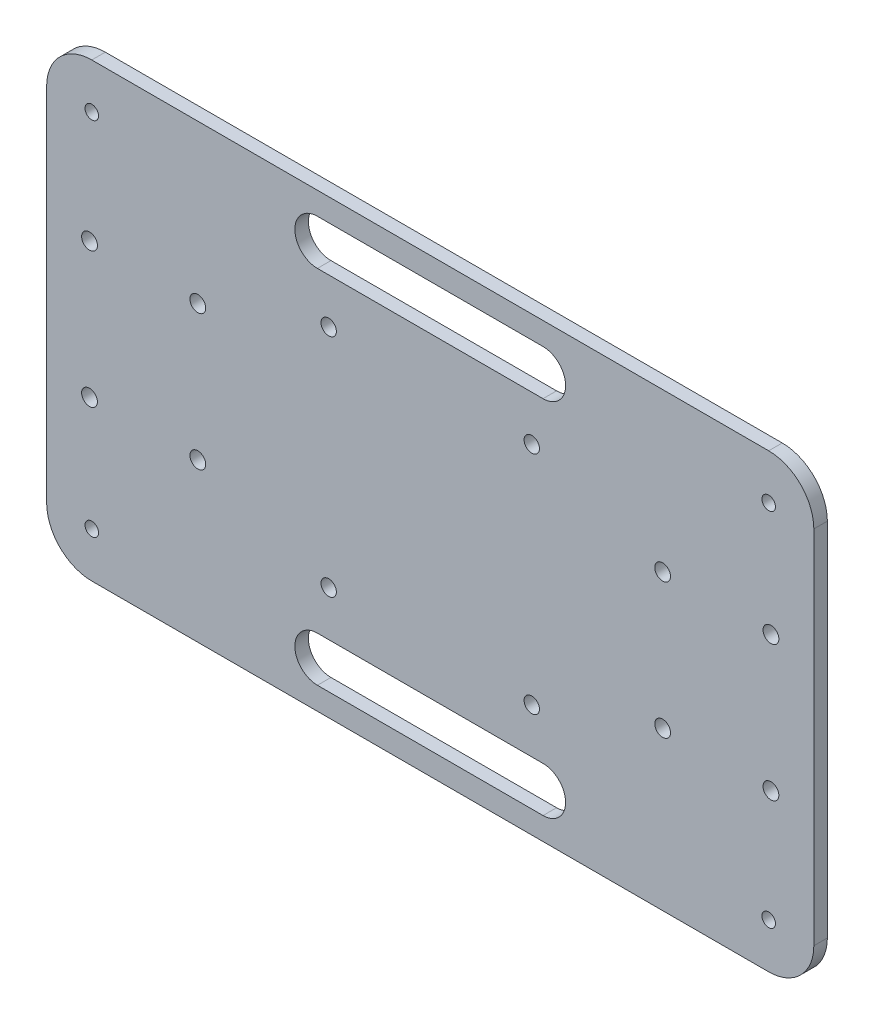
ISO-10303-21;
HEADER;
FILE_DESCRIPTION(('STEP AP214'),'2;1');
FILE_NAME('part.step','',(''),(''),'','','');
FILE_SCHEMA(('AUTOMOTIVE_DESIGN { 1 0 10303 214 1 1 1 1 }'));
ENDSEC;
DATA;
#1=APPLICATION_CONTEXT('core data for automotive mechanical design processes');
#2=APPLICATION_PROTOCOL_DEFINITION('international standard','automotive_design',2000,#1);
#3=PRODUCT_CONTEXT('',#1,'mechanical');
#4=PRODUCT('Part','Part','',(#3));
#5=PRODUCT_RELATED_PRODUCT_CATEGORY('part','',(#4));
#6=PRODUCT_DEFINITION_FORMATION('','',#4);
#7=PRODUCT_DEFINITION_CONTEXT('part definition',#1,'design');
#8=PRODUCT_DEFINITION('design','',#6,#7);
#9=PRODUCT_DEFINITION_SHAPE('','',#8);
#10=(LENGTH_UNIT() NAMED_UNIT(*) SI_UNIT(.MILLI.,.METRE.));
#11=(NAMED_UNIT(*) PLANE_ANGLE_UNIT() SI_UNIT($,.RADIAN.));
#12=(NAMED_UNIT(*) SI_UNIT($,.STERADIAN.) SOLID_ANGLE_UNIT());
#13=UNCERTAINTY_MEASURE_WITH_UNIT(LENGTH_MEASURE(1.E-05),#10,'distance_accuracy_value','');
#14=(GEOMETRIC_REPRESENTATION_CONTEXT(3) GLOBAL_UNCERTAINTY_ASSIGNED_CONTEXT((#13)) GLOBAL_UNIT_ASSIGNED_CONTEXT((#10,
#11,#12)) REPRESENTATION_CONTEXT('',''));
#15=CARTESIAN_POINT('',(0.,0.,0.));
#16=DIRECTION('',(0.,0.,1.));
#17=DIRECTION('',(1.,0.,0.));
#18=AXIS2_PLACEMENT_3D('',#15,#16,#17);
#19=CARTESIAN_POINT('',(0.,-35.,3.));
#20=DIRECTION('',(0.,1.,0.));
#21=DIRECTION('',(0.,0.,1.));
#22=AXIS2_PLACEMENT_3D('',#19,#20,#21);
#23=PLANE('',#22);
#24=DIRECTION('',(1.,0.,0.));
#25=VECTOR('',#24,1.);
#26=CARTESIAN_POINT('',(0.,-35.,0.));
#27=LINE('',#26,#25);
#28=CARTESIAN_POINT('',(-25.,-35.,0.));
#29=VERTEX_POINT('',#28);
#30=CARTESIAN_POINT('',(25.,-35.,0.));
#31=VERTEX_POINT('',#30);
#32=EDGE_CURVE('E261',#29,#31,#27,.T.);
#33=ORIENTED_EDGE('',*,*,#32,.T.);
#34=DIRECTION('',(0.,0.,-1.));
#35=VECTOR('',#34,1.);
#36=CARTESIAN_POINT('',(25.,-35.,3.));
#37=LINE('',#36,#35);
#38=CARTESIAN_POINT('',(25.,-35.,3.));
#39=VERTEX_POINT('',#38);
#40=EDGE_CURVE('E11',#39,#31,#37,.T.);
#41=ORIENTED_EDGE('',*,*,#40,.F.);
#42=DIRECTION('',(1.,0.,0.));
#43=VECTOR('',#42,1.);
#44=CARTESIAN_POINT('',(0.,-35.,3.));
#45=LINE('',#44,#43);
#46=CARTESIAN_POINT('',(-25.,-35.,3.));
#47=VERTEX_POINT('',#46);
#48=EDGE_CURVE('E163',#47,#39,#45,.T.);
#49=ORIENTED_EDGE('',*,*,#48,.F.);
#50=DIRECTION('',(0.,0.,-1.));
#51=VECTOR('',#50,1.);
#52=CARTESIAN_POINT('',(-25.,-35.,3.));
#53=LINE('',#52,#51);
#54=EDGE_CURVE('E293',#47,#29,#53,.T.);
#55=ORIENTED_EDGE('',*,*,#54,.T.);
#56=EDGE_LOOP('',(#33,#41,#49,#55));
#57=FACE_BOUND('',#56,.T.);
#58=ADVANCED_FACE('F37',(#57),#23,.F.);
#59=CARTESIAN_POINT('',(25.,-40.,3.));
#60=DIRECTION('',(0.,0.,-1.));
#61=DIRECTION('',(-1.,0.,0.));
#62=AXIS2_PLACEMENT_3D('',#59,#60,#61);
#63=CYLINDRICAL_SURFACE('',#62,5.);
#64=CARTESIAN_POINT('',(25.,-40.,0.));
#65=DIRECTION('',(0.,0.,1.));
#66=DIRECTION('',(1.,0.,0.));
#67=AXIS2_PLACEMENT_3D('',#64,#65,#66);
#68=CIRCLE('',#67,5.);
#69=CARTESIAN_POINT('',(25.,-45.,0.));
#70=VERTEX_POINT('',#69);
#71=EDGE_CURVE('E169',#31,#70,#68,.F.);
#72=ORIENTED_EDGE('',*,*,#71,.T.);
#73=DIRECTION('',(0.,0.,-1.));
#74=VECTOR('',#73,1.);
#75=CARTESIAN_POINT('',(25.,-45.,3.));
#76=LINE('',#75,#74);
#77=CARTESIAN_POINT('',(25.,-45.,3.));
#78=VERTEX_POINT('',#77);
#79=EDGE_CURVE('E47',#78,#70,#76,.T.);
#80=ORIENTED_EDGE('',*,*,#79,.F.);
#81=CARTESIAN_POINT('',(25.,-40.,3.));
#82=DIRECTION('',(0.,0.,1.));
#83=DIRECTION('',(1.,0.,0.));
#84=AXIS2_PLACEMENT_3D('',#81,#82,#83);
#85=CIRCLE('',#84,5.);
#86=EDGE_CURVE('E156',#39,#78,#85,.F.);
#87=ORIENTED_EDGE('',*,*,#86,.F.);
#88=ORIENTED_EDGE('',*,*,#40,.T.);
#89=EDGE_LOOP('',(#72,#80,#87,#88));
#90=FACE_BOUND('',#89,.T.);
#91=ADVANCED_FACE('F168',(#90),#63,.F.);
#92=CARTESIAN_POINT('',(0.,-45.,3.));
#93=DIRECTION('',(0.,1.,0.));
#94=DIRECTION('',(0.,0.,1.));
#95=AXIS2_PLACEMENT_3D('',#92,#93,#94);
#96=PLANE('',#95);
#97=DIRECTION('',(1.,0.,0.));
#98=VECTOR('',#97,1.);
#99=CARTESIAN_POINT('',(0.,-45.,0.));
#100=LINE('',#99,#98);
#101=CARTESIAN_POINT('',(-25.,-45.,0.));
#102=VERTEX_POINT('',#101);
#103=EDGE_CURVE('E265',#102,#70,#100,.T.);
#104=ORIENTED_EDGE('',*,*,#103,.F.);
#105=DIRECTION('',(0.,0.,-1.));
#106=VECTOR('',#105,1.);
#107=CARTESIAN_POINT('',(-25.,-45.,3.));
#108=LINE('',#107,#106);
#109=CARTESIAN_POINT('',(-25.,-45.,3.));
#110=VERTEX_POINT('',#109);
#111=EDGE_CURVE('E108',#110,#102,#108,.T.);
#112=ORIENTED_EDGE('',*,*,#111,.F.);
#113=DIRECTION('',(1.,0.,0.));
#114=VECTOR('',#113,1.);
#115=CARTESIAN_POINT('',(0.,-45.,3.));
#116=LINE('',#115,#114);
#117=EDGE_CURVE('E161',#110,#78,#116,.T.);
#118=ORIENTED_EDGE('',*,*,#117,.T.);
#119=ORIENTED_EDGE('',*,*,#79,.T.);
#120=EDGE_LOOP('',(#104,#112,#118,#119));
#121=FACE_BOUND('',#120,.T.);
#122=ADVANCED_FACE('F174',(#121),#96,.T.);
#123=CARTESIAN_POINT('',(25.,40.,3.));
#124=DIRECTION('',(0.,0.,-1.));
#125=DIRECTION('',(-1.,0.,0.));
#126=AXIS2_PLACEMENT_3D('',#123,#124,#125);
#127=CYLINDRICAL_SURFACE('',#126,5.);
#128=CARTESIAN_POINT('',(25.,40.,0.));
#129=DIRECTION('',(0.,0.,1.));
#130=DIRECTION('',(1.,0.,0.));
#131=AXIS2_PLACEMENT_3D('',#128,#129,#130);
#132=CIRCLE('',#131,5.);
#133=CARTESIAN_POINT('',(25.,35.,0.));
#134=VERTEX_POINT('',#133);
#135=CARTESIAN_POINT('',(25.,45.,0.));
#136=VERTEX_POINT('',#135);
#137=EDGE_CURVE('E249',#134,#136,#132,.T.);
#138=ORIENTED_EDGE('',*,*,#137,.F.);
#139=DIRECTION('',(0.,0.,-1.));
#140=VECTOR('',#139,1.);
#141=CARTESIAN_POINT('',(25.,35.,3.));
#142=LINE('',#141,#140);
#143=CARTESIAN_POINT('',(25.,35.,3.));
#144=VERTEX_POINT('',#143);
#145=EDGE_CURVE('E295',#144,#134,#142,.T.);
#146=ORIENTED_EDGE('',*,*,#145,.F.);
#147=CARTESIAN_POINT('',(25.,40.,3.));
#148=DIRECTION('',(0.,0.,1.));
#149=DIRECTION('',(1.,0.,0.));
#150=AXIS2_PLACEMENT_3D('',#147,#148,#149);
#151=CIRCLE('',#150,5.);
#152=CARTESIAN_POINT('',(25.,45.,3.));
#153=VERTEX_POINT('',#152);
#154=EDGE_CURVE('E381',#144,#153,#151,.T.);
#155=ORIENTED_EDGE('',*,*,#154,.T.);
#156=DIRECTION('',(0.,0.,-1.));
#157=VECTOR('',#156,1.);
#158=CARTESIAN_POINT('',(25.,45.,3.));
#159=LINE('',#158,#157);
#160=EDGE_CURVE('E297',#153,#136,#159,.T.);
#161=ORIENTED_EDGE('',*,*,#160,.T.);
#162=EDGE_LOOP('',(#138,#146,#155,#161));
#163=FACE_BOUND('',#162,.T.);
#164=ADVANCED_FACE('F402',(#163),#127,.F.);
#165=CARTESIAN_POINT('',(0.,35.,3.));
#166=DIRECTION('',(0.,1.,0.));
#167=DIRECTION('',(0.,0.,1.));
#168=AXIS2_PLACEMENT_3D('',#165,#166,#167);
#169=PLANE('',#168);
#170=DIRECTION('',(1.,0.,0.));
#171=VECTOR('',#170,1.);
#172=CARTESIAN_POINT('',(0.,35.,0.));
#173=LINE('',#172,#171);
#174=CARTESIAN_POINT('',(-25.,35.,0.));
#175=VERTEX_POINT('',#174);
#176=EDGE_CURVE('E252',#175,#134,#173,.T.);
#177=ORIENTED_EDGE('',*,*,#176,.F.);
#178=DIRECTION('',(0.,0.,-1.));
#179=VECTOR('',#178,1.);
#180=CARTESIAN_POINT('',(-25.,35.,3.));
#181=LINE('',#180,#179);
#182=CARTESIAN_POINT('',(-25.,35.,3.));
#183=VERTEX_POINT('',#182);
#184=EDGE_CURVE('E301',#183,#175,#181,.T.);
#185=ORIENTED_EDGE('',*,*,#184,.F.);
#186=DIRECTION('',(1.,0.,0.));
#187=VECTOR('',#186,1.);
#188=CARTESIAN_POINT('',(0.,35.,3.));
#189=LINE('',#188,#187);
#190=EDGE_CURVE('E384',#183,#144,#189,.T.);
#191=ORIENTED_EDGE('',*,*,#190,.T.);
#192=ORIENTED_EDGE('',*,*,#145,.T.);
#193=EDGE_LOOP('',(#177,#185,#191,#192));
#194=FACE_BOUND('',#193,.T.);
#195=ADVANCED_FACE('F405',(#194),#169,.T.);
#196=CARTESIAN_POINT('',(-25.,40.,3.));
#197=DIRECTION('',(0.,0.,-1.));
#198=DIRECTION('',(-1.,0.,0.));
#199=AXIS2_PLACEMENT_3D('',#196,#197,#198);
#200=CYLINDRICAL_SURFACE('',#199,5.);
#201=CARTESIAN_POINT('',(-25.,40.,0.));
#202=DIRECTION('',(0.,0.,1.));
#203=DIRECTION('',(1.,0.,0.));
#204=AXIS2_PLACEMENT_3D('',#201,#202,#203);
#205=CIRCLE('',#204,5.);
#206=CARTESIAN_POINT('',(-25.,45.,0.));
#207=VERTEX_POINT('',#206);
#208=EDGE_CURVE('E255',#207,#175,#205,.T.);
#209=ORIENTED_EDGE('',*,*,#208,.F.);
#210=DIRECTION('',(0.,0.,-1.));
#211=VECTOR('',#210,1.);
#212=CARTESIAN_POINT('',(-25.,45.,3.));
#213=LINE('',#212,#211);
#214=CARTESIAN_POINT('',(-25.,45.,3.));
#215=VERTEX_POINT('',#214);
#216=EDGE_CURVE('E299',#215,#207,#213,.T.);
#217=ORIENTED_EDGE('',*,*,#216,.F.);
#218=CARTESIAN_POINT('',(-25.,40.,3.));
#219=DIRECTION('',(0.,0.,1.));
#220=DIRECTION('',(1.,0.,0.));
#221=AXIS2_PLACEMENT_3D('',#218,#219,#220);
#222=CIRCLE('',#221,5.);
#223=EDGE_CURVE('E387',#215,#183,#222,.T.);
#224=ORIENTED_EDGE('',*,*,#223,.T.);
#225=ORIENTED_EDGE('',*,*,#184,.T.);
#226=EDGE_LOOP('',(#209,#217,#224,#225));
#227=FACE_BOUND('',#226,.T.);
#228=ADVANCED_FACE('F408',(#227),#200,.F.);
#229=CARTESIAN_POINT('',(85.,0.,3.));
#230=DIRECTION('',(1.,0.,0.));
#231=DIRECTION('',(0.,0.,-1.));
#232=AXIS2_PLACEMENT_3D('',#229,#230,#231);
#233=PLANE('',#232);
#234=DIRECTION('',(0.,-1.,0.));
#235=VECTOR('',#234,1.);
#236=CARTESIAN_POINT('',(85.,0.,0.));
#237=LINE('',#236,#235);
#238=CARTESIAN_POINT('',(85.,39.9999999999999,0.));
#239=VERTEX_POINT('',#238);
#240=CARTESIAN_POINT('',(85.,-39.9999999999999,0.));
#241=VERTEX_POINT('',#240);
#242=EDGE_CURVE('E204',#239,#241,#237,.T.);
#243=ORIENTED_EDGE('',*,*,#242,.F.);
#244=DIRECTION('',(0.,0.,-1.));
#245=VECTOR('',#244,1.);
#246=CARTESIAN_POINT('',(85.,39.9999999999999,3.));
#247=LINE('',#246,#245);
#248=CARTESIAN_POINT('',(85.,39.9999999999999,3.));
#249=VERTEX_POINT('',#248);
#250=EDGE_CURVE('E41',#249,#239,#247,.T.);
#251=ORIENTED_EDGE('',*,*,#250,.F.);
#252=DIRECTION('',(0.,-1.,0.));
#253=VECTOR('',#252,1.);
#254=CARTESIAN_POINT('',(85.,0.,3.));
#255=LINE('',#254,#253);
#256=CARTESIAN_POINT('',(85.,-39.9999999999999,3.));
#257=VERTEX_POINT('',#256);
#258=EDGE_CURVE('E292',#249,#257,#255,.T.);
#259=ORIENTED_EDGE('',*,*,#258,.T.);
#260=DIRECTION('',(0.,0.,-1.));
#261=VECTOR('',#260,1.);
#262=CARTESIAN_POINT('',(85.,-39.9999999999999,3.));
#263=LINE('',#262,#261);
#264=EDGE_CURVE('E203',#257,#241,#263,.T.);
#265=ORIENTED_EDGE('',*,*,#264,.T.);
#266=EDGE_LOOP('',(#243,#251,#259,#265));
#267=FACE_BOUND('',#266,.T.);
#268=ADVANCED_FACE('F39',(#267),#233,.T.);
#269=CARTESIAN_POINT('',(75.,40.,3.));
#270=DIRECTION('',(0.,0.,-1.));
#271=DIRECTION('',(-1.,0.,0.));
#272=AXIS2_PLACEMENT_3D('',#269,#270,#271);
#273=CYLINDRICAL_SURFACE('',#272,9.99999999999999);
#274=CARTESIAN_POINT('',(75.,40.,0.));
#275=DIRECTION('',(0.,0.,1.));
#276=DIRECTION('',(1.,0.,0.));
#277=AXIS2_PLACEMENT_3D('',#274,#275,#276);
#278=CIRCLE('',#277,9.99999999999999);
#279=CARTESIAN_POINT('',(75.,50.,0.));
#280=VERTEX_POINT('',#279);
#281=EDGE_CURVE('E207',#280,#239,#278,.F.);
#282=ORIENTED_EDGE('',*,*,#281,.F.);
#283=DIRECTION('',(0.,0.,-1.));
#284=VECTOR('',#283,1.);
#285=CARTESIAN_POINT('',(75.,50.,3.));
#286=LINE('',#285,#284);
#287=CARTESIAN_POINT('',(75.,50.,3.));
#288=VERTEX_POINT('',#287);
#289=EDGE_CURVE('E317',#288,#280,#286,.T.);
#290=ORIENTED_EDGE('',*,*,#289,.F.);
#291=CARTESIAN_POINT('',(75.,40.,3.));
#292=DIRECTION('',(0.,0.,1.));
#293=DIRECTION('',(1.,0.,0.));
#294=AXIS2_PLACEMENT_3D('',#291,#292,#293);
#295=CIRCLE('',#294,9.99999999999999);
#296=EDGE_CURVE('E326',#288,#249,#295,.F.);
#297=ORIENTED_EDGE('',*,*,#296,.T.);
#298=ORIENTED_EDGE('',*,*,#250,.T.);
#299=EDGE_LOOP('',(#282,#290,#297,#298));
#300=FACE_BOUND('',#299,.T.);
#301=ADVANCED_FACE('F324',(#300),#273,.T.);
#302=CARTESIAN_POINT('',(0.,50.,3.));
#303=DIRECTION('',(0.,1.,0.));
#304=DIRECTION('',(0.,0.,1.));
#305=AXIS2_PLACEMENT_3D('',#302,#303,#304);
#306=PLANE('',#305);
#307=DIRECTION('',(1.,0.,0.));
#308=VECTOR('',#307,1.);
#309=CARTESIAN_POINT('',(0.,50.,0.));
#310=LINE('',#309,#308);
#311=CARTESIAN_POINT('',(-74.9999999999999,50.,0.));
#312=VERTEX_POINT('',#311);
#313=EDGE_CURVE('E210',#312,#280,#310,.T.);
#314=ORIENTED_EDGE('',*,*,#313,.F.);
#315=DIRECTION('',(0.,0.,-1.));
#316=VECTOR('',#315,1.);
#317=CARTESIAN_POINT('',(-74.9999999999999,50.,3.));
#318=LINE('',#317,#316);
#319=CARTESIAN_POINT('',(-74.9999999999999,50.,3.));
#320=VERTEX_POINT('',#319);
#321=EDGE_CURVE('E316',#320,#312,#318,.T.);
#322=ORIENTED_EDGE('',*,*,#321,.F.);
#323=DIRECTION('',(1.,0.,0.));
#324=VECTOR('',#323,1.);
#325=CARTESIAN_POINT('',(0.,50.,3.));
#326=LINE('',#325,#324);
#327=EDGE_CURVE('E336',#320,#288,#326,.T.);
#328=ORIENTED_EDGE('',*,*,#327,.T.);
#329=ORIENTED_EDGE('',*,*,#289,.T.);
#330=EDGE_LOOP('',(#314,#322,#328,#329));
#331=FACE_BOUND('',#330,.T.);
#332=ADVANCED_FACE('F334',(#331),#306,.T.);
#333=CARTESIAN_POINT('',(-75.,40.,3.));
#334=DIRECTION('',(0.,0.,-1.));
#335=DIRECTION('',(-1.,0.,0.));
#336=AXIS2_PLACEMENT_3D('',#333,#334,#335);
#337=CYLINDRICAL_SURFACE('',#336,9.99999999999999);
#338=CARTESIAN_POINT('',(-75.,40.,0.));
#339=DIRECTION('',(0.,0.,1.));
#340=DIRECTION('',(1.,0.,0.));
#341=AXIS2_PLACEMENT_3D('',#338,#339,#340);
#342=CIRCLE('',#341,9.99999999999999);
#343=CARTESIAN_POINT('',(-85.,39.9999999999999,0.));
#344=VERTEX_POINT('',#343);
#345=EDGE_CURVE('E213',#344,#312,#342,.F.);
#346=ORIENTED_EDGE('',*,*,#345,.F.);
#347=DIRECTION('',(0.,0.,-1.));
#348=VECTOR('',#347,1.);
#349=CARTESIAN_POINT('',(-85.,39.9999999999999,3.));
#350=LINE('',#349,#348);
#351=CARTESIAN_POINT('',(-85.,39.9999999999999,3.));
#352=VERTEX_POINT('',#351);
#353=EDGE_CURVE('E314',#352,#344,#350,.T.);
#354=ORIENTED_EDGE('',*,*,#353,.F.);
#355=CARTESIAN_POINT('',(-75.,40.,3.));
#356=DIRECTION('',(0.,0.,1.));
#357=DIRECTION('',(1.,0.,0.));
#358=AXIS2_PLACEMENT_3D('',#355,#356,#357);
#359=CIRCLE('',#358,9.99999999999999);
#360=EDGE_CURVE('E342',#352,#320,#359,.F.);
#361=ORIENTED_EDGE('',*,*,#360,.T.);
#362=ORIENTED_EDGE('',*,*,#321,.T.);
#363=EDGE_LOOP('',(#346,#354,#361,#362));
#364=FACE_BOUND('',#363,.T.);
#365=ADVANCED_FACE('F344',(#364),#337,.T.);
#366=CARTESIAN_POINT('',(-85.,0.,3.));
#367=DIRECTION('',(1.,0.,0.));
#368=DIRECTION('',(0.,0.,-1.));
#369=AXIS2_PLACEMENT_3D('',#366,#367,#368);
#370=PLANE('',#369);
#371=DIRECTION('',(0.,-1.,0.));
#372=VECTOR('',#371,1.);
#373=CARTESIAN_POINT('',(-85.,0.,0.));
#374=LINE('',#373,#372);
#375=CARTESIAN_POINT('',(-85.,-39.9999999999999,0.));
#376=VERTEX_POINT('',#375);
#377=EDGE_CURVE('E216',#344,#376,#374,.T.);
#378=ORIENTED_EDGE('',*,*,#377,.T.);
#379=DIRECTION('',(0.,0.,-1.));
#380=VECTOR('',#379,1.);
#381=CARTESIAN_POINT('',(-85.,-39.9999999999999,3.));
#382=LINE('',#381,#380);
#383=CARTESIAN_POINT('',(-85.,-39.9999999999999,3.));
#384=VERTEX_POINT('',#383);
#385=EDGE_CURVE('E311',#384,#376,#382,.T.);
#386=ORIENTED_EDGE('',*,*,#385,.F.);
#387=DIRECTION('',(0.,-1.,0.));
#388=VECTOR('',#387,1.);
#389=CARTESIAN_POINT('',(-85.,0.,3.));
#390=LINE('',#389,#388);
#391=EDGE_CURVE('E346',#352,#384,#390,.T.);
#392=ORIENTED_EDGE('',*,*,#391,.F.);
#393=ORIENTED_EDGE('',*,*,#353,.T.);
#394=EDGE_LOOP('',(#378,#386,#392,#393));
#395=FACE_BOUND('',#394,.T.);
#396=ADVANCED_FACE('F503',(#395),#370,.F.);
#397=CARTESIAN_POINT('',(-75.,-40.,3.));
#398=DIRECTION('',(0.,0.,-1.));
#399=DIRECTION('',(-1.,0.,0.));
#400=AXIS2_PLACEMENT_3D('',#397,#398,#399);
#401=CYLINDRICAL_SURFACE('',#400,9.99999999999999);
#402=CARTESIAN_POINT('',(-75.,-40.,0.));
#403=DIRECTION('',(0.,0.,1.));
#404=DIRECTION('',(1.,0.,0.));
#405=AXIS2_PLACEMENT_3D('',#402,#403,#404);
#406=CIRCLE('',#405,9.99999999999999);
#407=CARTESIAN_POINT('',(-74.9999999999999,-50.,0.));
#408=VERTEX_POINT('',#407);
#409=EDGE_CURVE('E218',#376,#408,#406,.T.);
#410=ORIENTED_EDGE('',*,*,#409,.T.);
#411=DIRECTION('',(0.,0.,-1.));
#412=VECTOR('',#411,1.);
#413=CARTESIAN_POINT('',(-74.9999999999999,-50.,3.));
#414=LINE('',#413,#412);
#415=CARTESIAN_POINT('',(-74.9999999999999,-50.,3.));
#416=VERTEX_POINT('',#415);
#417=EDGE_CURVE('E308',#416,#408,#414,.T.);
#418=ORIENTED_EDGE('',*,*,#417,.F.);
#419=CARTESIAN_POINT('',(-75.,-40.,3.));
#420=DIRECTION('',(0.,0.,1.));
#421=DIRECTION('',(1.,0.,0.));
#422=AXIS2_PLACEMENT_3D('',#419,#420,#421);
#423=CIRCLE('',#422,9.99999999999999);
#424=EDGE_CURVE('E348',#384,#416,#423,.T.);
#425=ORIENTED_EDGE('',*,*,#424,.F.);
#426=ORIENTED_EDGE('',*,*,#385,.T.);
#427=EDGE_LOOP('',(#410,#418,#425,#426));
#428=FACE_BOUND('',#427,.T.);
#429=ADVANCED_FACE('F499',(#428),#401,.T.);
#430=CARTESIAN_POINT('',(0.,-50.,3.));
#431=DIRECTION('',(0.,1.,0.));
#432=DIRECTION('',(0.,0.,1.));
#433=AXIS2_PLACEMENT_3D('',#430,#431,#432);
#434=PLANE('',#433);
#435=DIRECTION('',(1.,0.,0.));
#436=VECTOR('',#435,1.);
#437=CARTESIAN_POINT('',(0.,-50.,0.));
#438=LINE('',#437,#436);
#439=CARTESIAN_POINT('',(75.,-50.,0.));
#440=VERTEX_POINT('',#439);
#441=EDGE_CURVE('E220',#408,#440,#438,.T.);
#442=ORIENTED_EDGE('',*,*,#441,.T.);
#443=DIRECTION('',(0.,0.,-1.));
#444=VECTOR('',#443,1.);
#445=CARTESIAN_POINT('',(75.,-50.,3.));
#446=LINE('',#445,#444);
#447=CARTESIAN_POINT('',(75.,-50.,3.));
#448=VERTEX_POINT('',#447);
#449=EDGE_CURVE('E305',#448,#440,#446,.T.);
#450=ORIENTED_EDGE('',*,*,#449,.F.);
#451=DIRECTION('',(1.,0.,0.));
#452=VECTOR('',#451,1.);
#453=CARTESIAN_POINT('',(0.,-50.,3.));
#454=LINE('',#453,#452);
#455=EDGE_CURVE('E353',#416,#448,#454,.T.);
#456=ORIENTED_EDGE('',*,*,#455,.F.);
#457=ORIENTED_EDGE('',*,*,#417,.T.);
#458=EDGE_LOOP('',(#442,#450,#456,#457));
#459=FACE_BOUND('',#458,.T.);
#460=ADVANCED_FACE('F495',(#459),#434,.F.);
#461=CARTESIAN_POINT('',(-51.5,-15.,3.));
#462=DIRECTION('',(0.,0.,-1.));
#463=DIRECTION('',(-1.,0.,0.));
#464=AXIS2_PLACEMENT_3D('',#461,#462,#463);
#465=CYLINDRICAL_SURFACE('',#464,1.75);
#466=CARTESIAN_POINT('',(-51.5,-15.,3.));
#467=DIRECTION('',(0.,0.,1.));
#468=DIRECTION('',(1.,0.,0.));
#469=AXIS2_PLACEMENT_3D('',#466,#467,#468);
#470=CIRCLE('',#469,1.75);
#471=CARTESIAN_POINT('',(-49.75,-15.,3.));
#472=VERTEX_POINT('',#471);
#473=EDGE_CURVE('E197',#472,#472,#470,.T.);
#474=ORIENTED_EDGE('',*,*,#473,.T.);
#475=EDGE_LOOP('',(#474));
#476=FACE_BOUND('',#475,.T.);
#477=CARTESIAN_POINT('',(-51.5,-15.,0.));
#478=DIRECTION('',(0.,0.,1.));
#479=DIRECTION('',(1.,0.,0.));
#480=AXIS2_PLACEMENT_3D('',#477,#478,#479);
#481=CIRCLE('',#480,1.75);
#482=CARTESIAN_POINT('',(-49.75,-15.,0.));
#483=VERTEX_POINT('',#482);
#484=EDGE_CURVE('E286',#483,#483,#481,.T.);
#485=ORIENTED_EDGE('',*,*,#484,.F.);
#486=EDGE_LOOP('',(#485));
#487=FACE_BOUND('',#486,.T.);
#488=ADVANCED_FACE('F498',(#476,#487),#465,.F.);
#489=CARTESIAN_POINT('',(-75.5,15.,3.));
#490=DIRECTION('',(0.,0.,-1.));
#491=DIRECTION('',(-1.,0.,0.));
#492=AXIS2_PLACEMENT_3D('',#489,#490,#491);
#493=CYLINDRICAL_SURFACE('',#492,1.75);
#494=CARTESIAN_POINT('',(-75.5,15.,3.));
#495=DIRECTION('',(0.,0.,1.));
#496=DIRECTION('',(1.,0.,0.));
#497=AXIS2_PLACEMENT_3D('',#494,#495,#496);
#498=CIRCLE('',#497,1.75);
#499=CARTESIAN_POINT('',(-73.75,15.,3.));
#500=VERTEX_POINT('',#499);
#501=EDGE_CURVE('E194',#500,#500,#498,.T.);
#502=ORIENTED_EDGE('',*,*,#501,.T.);
#503=EDGE_LOOP('',(#502));
#504=FACE_BOUND('',#503,.T.);
#505=CARTESIAN_POINT('',(-75.5,15.,0.));
#506=DIRECTION('',(0.,0.,1.));
#507=DIRECTION('',(1.,0.,0.));
#508=AXIS2_PLACEMENT_3D('',#505,#506,#507);
#509=CIRCLE('',#508,1.75);
#510=CARTESIAN_POINT('',(-73.75,15.,0.));
#511=VERTEX_POINT('',#510);
#512=EDGE_CURVE('E283',#511,#511,#509,.T.);
#513=ORIENTED_EDGE('',*,*,#512,.F.);
#514=EDGE_LOOP('',(#513));
#515=FACE_BOUND('',#514,.T.);
#516=ADVANCED_FACE('F597',(#504,#515),#493,.F.);
#517=CARTESIAN_POINT('',(-75.5,-15.,3.));
#518=DIRECTION('',(0.,0.,-1.));
#519=DIRECTION('',(-1.,0.,0.));
#520=AXIS2_PLACEMENT_3D('',#517,#518,#519);
#521=CYLINDRICAL_SURFACE('',#520,1.75);
#522=CARTESIAN_POINT('',(-75.5,-15.,3.));
#523=DIRECTION('',(0.,0.,1.));
#524=DIRECTION('',(1.,0.,0.));
#525=AXIS2_PLACEMENT_3D('',#522,#523,#524);
#526=CIRCLE('',#525,1.75);
#527=CARTESIAN_POINT('',(-73.75,-15.,3.));
#528=VERTEX_POINT('',#527);
#529=EDGE_CURVE('E191',#528,#528,#526,.F.);
#530=ORIENTED_EDGE('',*,*,#529,.F.);
#531=EDGE_LOOP('',(#530));
#532=FACE_BOUND('',#531,.T.);
#533=CARTESIAN_POINT('',(-75.5,-15.,0.));
#534=DIRECTION('',(0.,0.,1.));
#535=DIRECTION('',(1.,0.,0.));
#536=AXIS2_PLACEMENT_3D('',#533,#534,#535);
#537=CIRCLE('',#536,1.75);
#538=CARTESIAN_POINT('',(-73.75,-15.,0.));
#539=VERTEX_POINT('',#538);
#540=EDGE_CURVE('E280',#539,#539,#537,.F.);
#541=ORIENTED_EDGE('',*,*,#540,.T.);
#542=EDGE_LOOP('',(#541));
#543=FACE_BOUND('',#542,.T.);
#544=ADVANCED_FACE('F605',(#532,#543),#521,.F.);
#545=CARTESIAN_POINT('',(75.5,15.,3.));
#546=DIRECTION('',(0.,0.,-1.));
#547=DIRECTION('',(-1.,0.,0.));
#548=AXIS2_PLACEMENT_3D('',#545,#546,#547);
#549=CYLINDRICAL_SURFACE('',#548,1.75);
#550=CARTESIAN_POINT('',(75.5,15.,3.));
#551=DIRECTION('',(0.,0.,1.));
#552=DIRECTION('',(1.,0.,0.));
#553=AXIS2_PLACEMENT_3D('',#550,#551,#552);
#554=CIRCLE('',#553,1.75);
#555=CARTESIAN_POINT('',(77.25,15.,3.));
#556=VERTEX_POINT('',#555);
#557=EDGE_CURVE('E188',#556,#556,#554,.F.);
#558=ORIENTED_EDGE('',*,*,#557,.F.);
#559=EDGE_LOOP('',(#558));
#560=FACE_BOUND('',#559,.T.);
#561=CARTESIAN_POINT('',(75.5,15.,0.));
#562=DIRECTION('',(0.,0.,1.));
#563=DIRECTION('',(1.,0.,0.));
#564=AXIS2_PLACEMENT_3D('',#561,#562,#563);
#565=CIRCLE('',#564,1.75);
#566=CARTESIAN_POINT('',(77.25,15.,0.));
#567=VERTEX_POINT('',#566);
#568=EDGE_CURVE('E277',#567,#567,#565,.F.);
#569=ORIENTED_EDGE('',*,*,#568,.T.);
#570=EDGE_LOOP('',(#569));
#571=FACE_BOUND('',#570,.T.);
#572=ADVANCED_FACE('F614',(#560,#571),#549,.F.);
#573=CARTESIAN_POINT('',(51.5,15.,3.));
#574=DIRECTION('',(0.,0.,-1.));
#575=DIRECTION('',(-1.,0.,0.));
#576=AXIS2_PLACEMENT_3D('',#573,#574,#575);
#577=CYLINDRICAL_SURFACE('',#576,1.75);
#578=CARTESIAN_POINT('',(51.5,15.,3.));
#579=DIRECTION('',(0.,0.,1.));
#580=DIRECTION('',(1.,0.,0.));
#581=AXIS2_PLACEMENT_3D('',#578,#579,#580);
#582=CIRCLE('',#581,1.75);
#583=CARTESIAN_POINT('',(53.25,15.,3.));
#584=VERTEX_POINT('',#583);
#585=EDGE_CURVE('E185',#584,#584,#582,.T.);
#586=ORIENTED_EDGE('',*,*,#585,.T.);
#587=EDGE_LOOP('',(#586));
#588=FACE_BOUND('',#587,.T.);
#589=CARTESIAN_POINT('',(51.5,15.,0.));
#590=DIRECTION('',(0.,0.,1.));
#591=DIRECTION('',(1.,0.,0.));
#592=AXIS2_PLACEMENT_3D('',#589,#590,#591);
#593=CIRCLE('',#592,1.75);
#594=CARTESIAN_POINT('',(53.25,15.,0.));
#595=VERTEX_POINT('',#594);
#596=EDGE_CURVE('E274',#595,#595,#593,.T.);
#597=ORIENTED_EDGE('',*,*,#596,.F.);
#598=EDGE_LOOP('',(#597));
#599=FACE_BOUND('',#598,.T.);
#600=ADVANCED_FACE('F623',(#588,#599),#577,.F.);
#601=CARTESIAN_POINT('',(75.5,-15.,3.));
#602=DIRECTION('',(0.,0.,-1.));
#603=DIRECTION('',(-1.,0.,0.));
#604=AXIS2_PLACEMENT_3D('',#601,#602,#603);
#605=CYLINDRICAL_SURFACE('',#604,1.75);
#606=CARTESIAN_POINT('',(75.5,-15.,3.));
#607=DIRECTION('',(0.,0.,1.));
#608=DIRECTION('',(1.,0.,0.));
#609=AXIS2_PLACEMENT_3D('',#606,#607,#608);
#610=CIRCLE('',#609,1.75);
#611=CARTESIAN_POINT('',(77.25,-15.,3.));
#612=VERTEX_POINT('',#611);
#613=EDGE_CURVE('E182',#612,#612,#610,.T.);
#614=ORIENTED_EDGE('',*,*,#613,.T.);
#615=EDGE_LOOP('',(#614));
#616=FACE_BOUND('',#615,.T.);
#617=CARTESIAN_POINT('',(75.5,-15.,0.));
#618=DIRECTION('',(0.,0.,1.));
#619=DIRECTION('',(1.,0.,0.));
#620=AXIS2_PLACEMENT_3D('',#617,#618,#619);
#621=CIRCLE('',#620,1.75);
#622=CARTESIAN_POINT('',(77.25,-15.,0.));
#623=VERTEX_POINT('',#622);
#624=EDGE_CURVE('E271',#623,#623,#621,.T.);
#625=ORIENTED_EDGE('',*,*,#624,.F.);
#626=EDGE_LOOP('',(#625));
#627=FACE_BOUND('',#626,.T.);
#628=ADVANCED_FACE('F632',(#616,#627),#605,.F.);
#629=CARTESIAN_POINT('',(51.5,-15.,3.));
#630=DIRECTION('',(0.,0.,-1.));
#631=DIRECTION('',(-1.,0.,0.));
#632=AXIS2_PLACEMENT_3D('',#629,#630,#631);
#633=CYLINDRICAL_SURFACE('',#632,1.75);
#634=CARTESIAN_POINT('',(51.5,-15.,3.));
#635=DIRECTION('',(0.,0.,1.));
#636=DIRECTION('',(1.,0.,0.));
#637=AXIS2_PLACEMENT_3D('',#634,#635,#636);
#638=CIRCLE('',#637,1.75);
#639=CARTESIAN_POINT('',(53.25,-15.,3.));
#640=VERTEX_POINT('',#639);
#641=EDGE_CURVE('E176',#640,#640,#638,.F.);
#642=ORIENTED_EDGE('',*,*,#641,.F.);
#643=EDGE_LOOP('',(#642));
#644=FACE_BOUND('',#643,.T.);
#645=CARTESIAN_POINT('',(51.5,-15.,0.));
#646=DIRECTION('',(0.,0.,1.));
#647=DIRECTION('',(1.,0.,0.));
#648=AXIS2_PLACEMENT_3D('',#645,#646,#647);
#649=CIRCLE('',#648,1.75);
#650=CARTESIAN_POINT('',(53.25,-15.,0.));
#651=VERTEX_POINT('',#650);
#652=EDGE_CURVE('E268',#651,#651,#649,.F.);
#653=ORIENTED_EDGE('',*,*,#652,.T.);
#654=EDGE_LOOP('',(#653));
#655=FACE_BOUND('',#654,.T.);
#656=ADVANCED_FACE('F641',(#644,#655),#633,.F.);
#657=CARTESIAN_POINT('',(-25.,-40.,3.));
#658=DIRECTION('',(0.,0.,-1.));
#659=DIRECTION('',(-1.,0.,0.));
#660=AXIS2_PLACEMENT_3D('',#657,#658,#659);
#661=CYLINDRICAL_SURFACE('',#660,5.);
#662=CARTESIAN_POINT('',(-25.,-40.,0.));
#663=DIRECTION('',(0.,0.,1.));
#664=DIRECTION('',(1.,0.,0.));
#665=AXIS2_PLACEMENT_3D('',#662,#663,#664);
#666=CIRCLE('',#665,5.);
#667=EDGE_CURVE('E111',#102,#29,#666,.F.);
#668=ORIENTED_EDGE('',*,*,#667,.T.);
#669=ORIENTED_EDGE('',*,*,#54,.F.);
#670=CARTESIAN_POINT('',(-25.,-40.,3.));
#671=DIRECTION('',(0.,0.,1.));
#672=DIRECTION('',(1.,0.,0.));
#673=AXIS2_PLACEMENT_3D('',#670,#671,#672);
#674=CIRCLE('',#673,5.);
#675=EDGE_CURVE('E56',#110,#47,#674,.F.);
#676=ORIENTED_EDGE('',*,*,#675,.F.);
#677=ORIENTED_EDGE('',*,*,#111,.T.);
#678=EDGE_LOOP('',(#668,#669,#676,#677));
#679=FACE_BOUND('',#678,.T.);
#680=ADVANCED_FACE('F458',(#679),#661,.F.);
#681=CARTESIAN_POINT('',(0.,45.,3.));
#682=DIRECTION('',(0.,1.,0.));
#683=DIRECTION('',(0.,0.,1.));
#684=AXIS2_PLACEMENT_3D('',#681,#682,#683);
#685=PLANE('',#684);
#686=DIRECTION('',(1.,0.,0.));
#687=VECTOR('',#686,1.);
#688=CARTESIAN_POINT('',(0.,45.,0.));
#689=LINE('',#688,#687);
#690=EDGE_CURVE('E258',#207,#136,#689,.T.);
#691=ORIENTED_EDGE('',*,*,#690,.T.);
#692=ORIENTED_EDGE('',*,*,#160,.F.);
#693=DIRECTION('',(1.,0.,0.));
#694=VECTOR('',#693,1.);
#695=CARTESIAN_POINT('',(0.,45.,3.));
#696=LINE('',#695,#694);
#697=EDGE_CURVE('E390',#215,#153,#696,.T.);
#698=ORIENTED_EDGE('',*,*,#697,.F.);
#699=ORIENTED_EDGE('',*,*,#216,.T.);
#700=EDGE_LOOP('',(#691,#692,#698,#699));
#701=FACE_BOUND('',#700,.T.);
#702=ADVANCED_FACE('F398',(#701),#685,.F.);
#703=CARTESIAN_POINT('',(-75.,-40.,3.));
#704=DIRECTION('',(0.,0.,-1.));
#705=DIRECTION('',(-1.,0.,0.));
#706=AXIS2_PLACEMENT_3D('',#703,#704,#705);
#707=CYLINDRICAL_SURFACE('',#706,1.5);
#708=CARTESIAN_POINT('',(-75.,-40.,3.));
#709=DIRECTION('',(0.,0.,1.));
#710=DIRECTION('',(1.,0.,0.));
#711=AXIS2_PLACEMENT_3D('',#708,#709,#710);
#712=CIRCLE('',#711,1.5);
#713=CARTESIAN_POINT('',(-73.5,-40.,3.));
#714=VERTEX_POINT('',#713);
#715=EDGE_CURVE('E378',#714,#714,#712,.T.);
#716=ORIENTED_EDGE('',*,*,#715,.T.);
#717=EDGE_LOOP('',(#716));
#718=FACE_BOUND('',#717,.T.);
#719=CARTESIAN_POINT('',(-75.,-40.,0.));
#720=DIRECTION('',(0.,0.,1.));
#721=DIRECTION('',(1.,0.,0.));
#722=AXIS2_PLACEMENT_3D('',#719,#720,#721);
#723=CIRCLE('',#722,1.5);
#724=CARTESIAN_POINT('',(-73.5,-40.,0.));
#725=VERTEX_POINT('',#724);
#726=EDGE_CURVE('E246',#725,#725,#723,.T.);
#727=ORIENTED_EDGE('',*,*,#726,.F.);
#728=EDGE_LOOP('',(#727));
#729=FACE_BOUND('',#728,.T.);
#730=ADVANCED_FACE('F457',(#718,#729),#707,.F.);
#731=CARTESIAN_POINT('',(-75.,40.,3.));
#732=DIRECTION('',(0.,0.,-1.));
#733=DIRECTION('',(-1.,0.,0.));
#734=AXIS2_PLACEMENT_3D('',#731,#732,#733);
#735=CYLINDRICAL_SURFACE('',#734,1.5);
#736=CARTESIAN_POINT('',(-75.,40.,3.));
#737=DIRECTION('',(0.,0.,1.));
#738=DIRECTION('',(1.,0.,0.));
#739=AXIS2_PLACEMENT_3D('',#736,#737,#738);
#740=CIRCLE('',#739,1.5);
#741=CARTESIAN_POINT('',(-73.5,40.,3.));
#742=VERTEX_POINT('',#741);
#743=EDGE_CURVE('E375',#742,#742,#740,.T.);
#744=ORIENTED_EDGE('',*,*,#743,.T.);
#745=EDGE_LOOP('',(#744));
#746=FACE_BOUND('',#745,.T.);
#747=CARTESIAN_POINT('',(-75.,40.,0.));
#748=DIRECTION('',(0.,0.,1.));
#749=DIRECTION('',(1.,0.,0.));
#750=AXIS2_PLACEMENT_3D('',#747,#748,#749);
#751=CIRCLE('',#750,1.5);
#752=CARTESIAN_POINT('',(-73.5,40.,0.));
#753=VERTEX_POINT('',#752);
#754=EDGE_CURVE('E243',#753,#753,#751,.T.);
#755=ORIENTED_EDGE('',*,*,#754,.F.);
#756=EDGE_LOOP('',(#755));
#757=FACE_BOUND('',#756,.T.);
#758=ADVANCED_FACE('F467',(#746,#757),#735,.F.);
#759=CARTESIAN_POINT('',(75.,40.,3.));
#760=DIRECTION('',(0.,0.,-1.));
#761=DIRECTION('',(-1.,0.,0.));
#762=AXIS2_PLACEMENT_3D('',#759,#760,#761);
#763=CYLINDRICAL_SURFACE('',#762,1.5);
#764=CARTESIAN_POINT('',(75.,40.,3.));
#765=DIRECTION('',(0.,0.,1.));
#766=DIRECTION('',(1.,0.,0.));
#767=AXIS2_PLACEMENT_3D('',#764,#765,#766);
#768=CIRCLE('',#767,1.5);
#769=CARTESIAN_POINT('',(76.5,40.,3.));
#770=VERTEX_POINT('',#769);
#771=EDGE_CURVE('E372',#770,#770,#768,.T.);
#772=ORIENTED_EDGE('',*,*,#771,.T.);
#773=EDGE_LOOP('',(#772));
#774=FACE_BOUND('',#773,.T.);
#775=CARTESIAN_POINT('',(75.,40.,0.));
#776=DIRECTION('',(0.,0.,1.));
#777=DIRECTION('',(1.,0.,0.));
#778=AXIS2_PLACEMENT_3D('',#775,#776,#777);
#779=CIRCLE('',#778,1.5);
#780=CARTESIAN_POINT('',(76.5,40.,0.));
#781=VERTEX_POINT('',#780);
#782=EDGE_CURVE('E240',#781,#781,#779,.T.);
#783=ORIENTED_EDGE('',*,*,#782,.F.);
#784=EDGE_LOOP('',(#783));
#785=FACE_BOUND('',#784,.T.);
#786=ADVANCED_FACE('F471',(#774,#785),#763,.F.);
#787=CARTESIAN_POINT('',(75.,-40.,3.));
#788=DIRECTION('',(0.,0.,-1.));
#789=DIRECTION('',(-1.,0.,0.));
#790=AXIS2_PLACEMENT_3D('',#787,#788,#789);
#791=CYLINDRICAL_SURFACE('',#790,1.5);
#792=CARTESIAN_POINT('',(75.,-40.,3.));
#793=DIRECTION('',(0.,0.,1.));
#794=DIRECTION('',(1.,0.,0.));
#795=AXIS2_PLACEMENT_3D('',#792,#793,#794);
#796=CIRCLE('',#795,1.5);
#797=CARTESIAN_POINT('',(76.5,-40.,3.));
#798=VERTEX_POINT('',#797);
#799=EDGE_CURVE('E369',#798,#798,#796,.T.);
#800=ORIENTED_EDGE('',*,*,#799,.T.);
#801=EDGE_LOOP('',(#800));
#802=FACE_BOUND('',#801,.T.);
#803=CARTESIAN_POINT('',(75.,-40.,0.));
#804=DIRECTION('',(0.,0.,1.));
#805=DIRECTION('',(1.,0.,0.));
#806=AXIS2_PLACEMENT_3D('',#803,#804,#805);
#807=CIRCLE('',#806,1.5);
#808=CARTESIAN_POINT('',(76.5,-40.,0.));
#809=VERTEX_POINT('',#808);
#810=EDGE_CURVE('E237',#809,#809,#807,.T.);
#811=ORIENTED_EDGE('',*,*,#810,.F.);
#812=EDGE_LOOP('',(#811));
#813=FACE_BOUND('',#812,.T.);
#814=ADVANCED_FACE('F475',(#802,#813),#791,.F.);
#815=CARTESIAN_POINT('',(-22.5,25.,3.));
#816=DIRECTION('',(0.,0.,-1.));
#817=DIRECTION('',(-1.,0.,0.));
#818=AXIS2_PLACEMENT_3D('',#815,#816,#817);
#819=CYLINDRICAL_SURFACE('',#818,1.7);
#820=CARTESIAN_POINT('',(-22.5,25.,3.));
#821=DIRECTION('',(0.,0.,1.));
#822=DIRECTION('',(1.,0.,0.));
#823=AXIS2_PLACEMENT_3D('',#820,#821,#822);
#824=CIRCLE('',#823,1.7);
#825=CARTESIAN_POINT('',(-20.8,25.,3.));
#826=VERTEX_POINT('',#825);
#827=EDGE_CURVE('E366',#826,#826,#824,.T.);
#828=ORIENTED_EDGE('',*,*,#827,.T.);
#829=EDGE_LOOP('',(#828));
#830=FACE_BOUND('',#829,.T.);
#831=CARTESIAN_POINT('',(-22.5,25.,0.));
#832=DIRECTION('',(0.,0.,1.));
#833=DIRECTION('',(1.,0.,0.));
#834=AXIS2_PLACEMENT_3D('',#831,#832,#833);
#835=CIRCLE('',#834,1.7);
#836=CARTESIAN_POINT('',(-20.8,25.,0.));
#837=VERTEX_POINT('',#836);
#838=EDGE_CURVE('E234',#837,#837,#835,.T.);
#839=ORIENTED_EDGE('',*,*,#838,.F.);
#840=EDGE_LOOP('',(#839));
#841=FACE_BOUND('',#840,.T.);
#842=ADVANCED_FACE('F479',(#830,#841),#819,.F.);
#843=CARTESIAN_POINT('',(22.5,25.,3.));
#844=DIRECTION('',(0.,0.,-1.));
#845=DIRECTION('',(-1.,0.,0.));
#846=AXIS2_PLACEMENT_3D('',#843,#844,#845);
#847=CYLINDRICAL_SURFACE('',#846,1.7);
#848=CARTESIAN_POINT('',(22.5,25.,3.));
#849=DIRECTION('',(0.,0.,1.));
#850=DIRECTION('',(1.,0.,0.));
#851=AXIS2_PLACEMENT_3D('',#848,#849,#850);
#852=CIRCLE('',#851,1.7);
#853=CARTESIAN_POINT('',(24.2,25.,3.));
#854=VERTEX_POINT('',#853);
#855=EDGE_CURVE('E363',#854,#854,#852,.T.);
#856=ORIENTED_EDGE('',*,*,#855,.T.);
#857=EDGE_LOOP('',(#856));
#858=FACE_BOUND('',#857,.T.);
#859=CARTESIAN_POINT('',(22.5,25.,0.));
#860=DIRECTION('',(0.,0.,1.));
#861=DIRECTION('',(1.,0.,0.));
#862=AXIS2_PLACEMENT_3D('',#859,#860,#861);
#863=CIRCLE('',#862,1.7);
#864=CARTESIAN_POINT('',(24.2,25.,0.));
#865=VERTEX_POINT('',#864);
#866=EDGE_CURVE('E231',#865,#865,#863,.T.);
#867=ORIENTED_EDGE('',*,*,#866,.F.);
#868=EDGE_LOOP('',(#867));
#869=FACE_BOUND('',#868,.T.);
#870=ADVANCED_FACE('F483',(#858,#869),#847,.F.);
#871=CARTESIAN_POINT('',(22.5,-25.,3.));
#872=DIRECTION('',(0.,0.,-1.));
#873=DIRECTION('',(-1.,0.,0.));
#874=AXIS2_PLACEMENT_3D('',#871,#872,#873);
#875=CYLINDRICAL_SURFACE('',#874,1.7);
#876=CARTESIAN_POINT('',(22.5,-25.,3.));
#877=DIRECTION('',(0.,0.,1.));
#878=DIRECTION('',(1.,0.,0.));
#879=AXIS2_PLACEMENT_3D('',#876,#877,#878);
#880=CIRCLE('',#879,1.7);
#881=CARTESIAN_POINT('',(24.2,-25.,3.));
#882=VERTEX_POINT('',#881);
#883=EDGE_CURVE('E360',#882,#882,#880,.T.);
#884=ORIENTED_EDGE('',*,*,#883,.T.);
#885=EDGE_LOOP('',(#884));
#886=FACE_BOUND('',#885,.T.);
#887=CARTESIAN_POINT('',(22.5,-25.,0.));
#888=DIRECTION('',(0.,0.,1.));
#889=DIRECTION('',(1.,0.,0.));
#890=AXIS2_PLACEMENT_3D('',#887,#888,#889);
#891=CIRCLE('',#890,1.7);
#892=CARTESIAN_POINT('',(24.2,-25.,0.));
#893=VERTEX_POINT('',#892);
#894=EDGE_CURVE('E228',#893,#893,#891,.T.);
#895=ORIENTED_EDGE('',*,*,#894,.F.);
#896=EDGE_LOOP('',(#895));
#897=FACE_BOUND('',#896,.T.);
#898=ADVANCED_FACE('F487',(#886,#897),#875,.F.);
#899=CARTESIAN_POINT('',(-22.5,-25.,3.));
#900=DIRECTION('',(0.,0.,-1.));
#901=DIRECTION('',(-1.,0.,0.));
#902=AXIS2_PLACEMENT_3D('',#899,#900,#901);
#903=CYLINDRICAL_SURFACE('',#902,1.7);
#904=CARTESIAN_POINT('',(-22.5,-25.,3.));
#905=DIRECTION('',(0.,0.,1.));
#906=DIRECTION('',(1.,0.,0.));
#907=AXIS2_PLACEMENT_3D('',#904,#905,#906);
#908=CIRCLE('',#907,1.7);
#909=CARTESIAN_POINT('',(-20.8,-25.,3.));
#910=VERTEX_POINT('',#909);
#911=EDGE_CURVE('E357',#910,#910,#908,.T.);
#912=ORIENTED_EDGE('',*,*,#911,.T.);
#913=EDGE_LOOP('',(#912));
#914=FACE_BOUND('',#913,.T.);
#915=CARTESIAN_POINT('',(-22.5,-25.,0.));
#916=DIRECTION('',(0.,0.,1.));
#917=DIRECTION('',(1.,0.,0.));
#918=AXIS2_PLACEMENT_3D('',#915,#916,#917);
#919=CIRCLE('',#918,1.7);
#920=CARTESIAN_POINT('',(-20.8,-25.,0.));
#921=VERTEX_POINT('',#920);
#922=EDGE_CURVE('E225',#921,#921,#919,.T.);
#923=ORIENTED_EDGE('',*,*,#922,.F.);
#924=EDGE_LOOP('',(#923));
#925=FACE_BOUND('',#924,.T.);
#926=ADVANCED_FACE('F441',(#914,#925),#903,.F.);
#927=CARTESIAN_POINT('',(75.,-40.,3.));
#928=DIRECTION('',(0.,0.,-1.));
#929=DIRECTION('',(-1.,0.,0.));
#930=AXIS2_PLACEMENT_3D('',#927,#928,#929);
#931=CYLINDRICAL_SURFACE('',#930,9.99999999999999);
#932=CARTESIAN_POINT('',(75.,-40.,0.));
#933=DIRECTION('',(0.,0.,1.));
#934=DIRECTION('',(1.,0.,0.));
#935=AXIS2_PLACEMENT_3D('',#932,#933,#934);
#936=CIRCLE('',#935,9.99999999999999);
#937=EDGE_CURVE('E222',#440,#241,#936,.T.);
#938=ORIENTED_EDGE('',*,*,#937,.T.);
#939=ORIENTED_EDGE('',*,*,#264,.F.);
#940=CARTESIAN_POINT('',(75.,-40.,3.));
#941=DIRECTION('',(0.,0.,1.));
#942=DIRECTION('',(1.,0.,0.));
#943=AXIS2_PLACEMENT_3D('',#940,#941,#942);
#944=CIRCLE('',#943,9.99999999999999);
#945=EDGE_CURVE('E355',#448,#257,#944,.T.);
#946=ORIENTED_EDGE('',*,*,#945,.F.);
#947=ORIENTED_EDGE('',*,*,#449,.T.);
#948=EDGE_LOOP('',(#938,#939,#946,#947));
#949=FACE_BOUND('',#948,.T.);
#950=ADVANCED_FACE('F433',(#949),#931,.T.);
#951=CARTESIAN_POINT('',(-51.5,15.,3.));
#952=DIRECTION('',(0.,0.,-1.));
#953=DIRECTION('',(-1.,0.,0.));
#954=AXIS2_PLACEMENT_3D('',#951,#952,#953);
#955=CYLINDRICAL_SURFACE('',#954,1.75);
#956=CARTESIAN_POINT('',(-51.5,15.,3.));
#957=DIRECTION('',(0.,0.,1.));
#958=DIRECTION('',(1.,0.,0.));
#959=AXIS2_PLACEMENT_3D('',#956,#957,#958);
#960=CIRCLE('',#959,1.75);
#961=CARTESIAN_POINT('',(-49.75,15.,3.));
#962=VERTEX_POINT('',#961);
#963=EDGE_CURVE('E200',#962,#962,#960,.F.);
#964=ORIENTED_EDGE('',*,*,#963,.F.);
#965=EDGE_LOOP('',(#964));
#966=FACE_BOUND('',#965,.T.);
#967=CARTESIAN_POINT('',(-51.5,15.,0.));
#968=DIRECTION('',(0.,0.,1.));
#969=DIRECTION('',(1.,0.,0.));
#970=AXIS2_PLACEMENT_3D('',#967,#968,#969);
#971=CIRCLE('',#970,1.75);
#972=CARTESIAN_POINT('',(-49.75,15.,0.));
#973=VERTEX_POINT('',#972);
#974=EDGE_CURVE('E289',#973,#973,#971,.F.);
#975=ORIENTED_EDGE('',*,*,#974,.T.);
#976=EDGE_LOOP('',(#975));
#977=FACE_BOUND('',#976,.T.);
#978=ADVANCED_FACE('F431',(#966,#977),#955,.F.);
#979=CARTESIAN_POINT('',(0.,0.,3.));
#980=DIRECTION('',(0.,0.,1.));
#981=DIRECTION('',(1.,0.,0.));
#982=AXIS2_PLACEMENT_3D('',#979,#980,#981);
#983=PLANE('',#982);
#984=ORIENTED_EDGE('',*,*,#258,.F.);
#985=ORIENTED_EDGE('',*,*,#296,.F.);
#986=ORIENTED_EDGE('',*,*,#327,.F.);
#987=ORIENTED_EDGE('',*,*,#360,.F.);
#988=ORIENTED_EDGE('',*,*,#391,.T.);
#989=ORIENTED_EDGE('',*,*,#424,.T.);
#990=ORIENTED_EDGE('',*,*,#455,.T.);
#991=ORIENTED_EDGE('',*,*,#945,.T.);
#992=EDGE_LOOP('',(#984,#985,#986,#987,#988,#989,#990,#991));
#993=FACE_BOUND('',#992,.T.);
#994=ORIENTED_EDGE('',*,*,#911,.F.);
#995=EDGE_LOOP('',(#994));
#996=FACE_BOUND('',#995,.T.);
#997=ORIENTED_EDGE('',*,*,#883,.F.);
#998=EDGE_LOOP('',(#997));
#999=FACE_BOUND('',#998,.T.);
#1000=ORIENTED_EDGE('',*,*,#855,.F.);
#1001=EDGE_LOOP('',(#1000));
#1002=FACE_BOUND('',#1001,.T.);
#1003=ORIENTED_EDGE('',*,*,#827,.F.);
#1004=EDGE_LOOP('',(#1003));
#1005=FACE_BOUND('',#1004,.T.);
#1006=ORIENTED_EDGE('',*,*,#799,.F.);
#1007=EDGE_LOOP('',(#1006));
#1008=FACE_BOUND('',#1007,.T.);
#1009=ORIENTED_EDGE('',*,*,#771,.F.);
#1010=EDGE_LOOP('',(#1009));
#1011=FACE_BOUND('',#1010,.T.);
#1012=ORIENTED_EDGE('',*,*,#743,.F.);
#1013=EDGE_LOOP('',(#1012));
#1014=FACE_BOUND('',#1013,.T.);
#1015=ORIENTED_EDGE('',*,*,#715,.F.);
#1016=EDGE_LOOP('',(#1015));
#1017=FACE_BOUND('',#1016,.T.);
#1018=ORIENTED_EDGE('',*,*,#154,.F.);
#1019=ORIENTED_EDGE('',*,*,#190,.F.);
#1020=ORIENTED_EDGE('',*,*,#223,.F.);
#1021=ORIENTED_EDGE('',*,*,#697,.T.);
#1022=EDGE_LOOP('',(#1018,#1019,#1020,#1021));
#1023=FACE_BOUND('',#1022,.T.);
#1024=ORIENTED_EDGE('',*,*,#48,.T.);
#1025=ORIENTED_EDGE('',*,*,#86,.T.);
#1026=ORIENTED_EDGE('',*,*,#117,.F.);
#1027=ORIENTED_EDGE('',*,*,#675,.T.);
#1028=EDGE_LOOP('',(#1024,#1025,#1026,#1027));
#1029=FACE_BOUND('',#1028,.T.);
#1030=ORIENTED_EDGE('',*,*,#641,.T.);
#1031=EDGE_LOOP('',(#1030));
#1032=FACE_BOUND('',#1031,.T.);
#1033=ORIENTED_EDGE('',*,*,#613,.F.);
#1034=EDGE_LOOP('',(#1033));
#1035=FACE_BOUND('',#1034,.T.);
#1036=ORIENTED_EDGE('',*,*,#585,.F.);
#1037=EDGE_LOOP('',(#1036));
#1038=FACE_BOUND('',#1037,.T.);
#1039=ORIENTED_EDGE('',*,*,#557,.T.);
#1040=EDGE_LOOP('',(#1039));
#1041=FACE_BOUND('',#1040,.T.);
#1042=ORIENTED_EDGE('',*,*,#529,.T.);
#1043=EDGE_LOOP('',(#1042));
#1044=FACE_BOUND('',#1043,.T.);
#1045=ORIENTED_EDGE('',*,*,#501,.F.);
#1046=EDGE_LOOP('',(#1045));
#1047=FACE_BOUND('',#1046,.T.);
#1048=ORIENTED_EDGE('',*,*,#473,.F.);
#1049=EDGE_LOOP('',(#1048));
#1050=FACE_BOUND('',#1049,.T.);
#1051=ORIENTED_EDGE('',*,*,#963,.T.);
#1052=EDGE_LOOP('',(#1051));
#1053=FACE_BOUND('',#1052,.T.);
#1054=ADVANCED_FACE('F158',(#993,#996,#999,#1002,#1005,#1008,#1011,#1014,#1017,#1023,#1029,
#1032,#1035,#1038,#1041,#1044,#1047,#1050,#1053),#983,.T.);
#1055=CARTESIAN_POINT('',(0.,0.,0.));
#1056=DIRECTION('',(0.,0.,1.));
#1057=DIRECTION('',(1.,0.,0.));
#1058=AXIS2_PLACEMENT_3D('',#1055,#1056,#1057);
#1059=PLANE('',#1058);
#1060=ORIENTED_EDGE('',*,*,#242,.T.);
#1061=ORIENTED_EDGE('',*,*,#937,.F.);
#1062=ORIENTED_EDGE('',*,*,#441,.F.);
#1063=ORIENTED_EDGE('',*,*,#409,.F.);
#1064=ORIENTED_EDGE('',*,*,#377,.F.);
#1065=ORIENTED_EDGE('',*,*,#345,.T.);
#1066=ORIENTED_EDGE('',*,*,#313,.T.);
#1067=ORIENTED_EDGE('',*,*,#281,.T.);
#1068=EDGE_LOOP('',(#1060,#1061,#1062,#1063,#1064,#1065,#1066,#1067));
#1069=FACE_BOUND('',#1068,.T.);
#1070=ORIENTED_EDGE('',*,*,#922,.T.);
#1071=EDGE_LOOP('',(#1070));
#1072=FACE_BOUND('',#1071,.T.);
#1073=ORIENTED_EDGE('',*,*,#894,.T.);
#1074=EDGE_LOOP('',(#1073));
#1075=FACE_BOUND('',#1074,.T.);
#1076=ORIENTED_EDGE('',*,*,#866,.T.);
#1077=EDGE_LOOP('',(#1076));
#1078=FACE_BOUND('',#1077,.T.);
#1079=ORIENTED_EDGE('',*,*,#838,.T.);
#1080=EDGE_LOOP('',(#1079));
#1081=FACE_BOUND('',#1080,.T.);
#1082=ORIENTED_EDGE('',*,*,#810,.T.);
#1083=EDGE_LOOP('',(#1082));
#1084=FACE_BOUND('',#1083,.T.);
#1085=ORIENTED_EDGE('',*,*,#782,.T.);
#1086=EDGE_LOOP('',(#1085));
#1087=FACE_BOUND('',#1086,.T.);
#1088=ORIENTED_EDGE('',*,*,#754,.T.);
#1089=EDGE_LOOP('',(#1088));
#1090=FACE_BOUND('',#1089,.T.);
#1091=ORIENTED_EDGE('',*,*,#726,.T.);
#1092=EDGE_LOOP('',(#1091));
#1093=FACE_BOUND('',#1092,.T.);
#1094=ORIENTED_EDGE('',*,*,#137,.T.);
#1095=ORIENTED_EDGE('',*,*,#690,.F.);
#1096=ORIENTED_EDGE('',*,*,#208,.T.);
#1097=ORIENTED_EDGE('',*,*,#176,.T.);
#1098=EDGE_LOOP('',(#1094,#1095,#1096,#1097));
#1099=FACE_BOUND('',#1098,.T.);
#1100=ORIENTED_EDGE('',*,*,#32,.F.);
#1101=ORIENTED_EDGE('',*,*,#667,.F.);
#1102=ORIENTED_EDGE('',*,*,#103,.T.);
#1103=ORIENTED_EDGE('',*,*,#71,.F.);
#1104=EDGE_LOOP('',(#1100,#1101,#1102,#1103));
#1105=FACE_BOUND('',#1104,.T.);
#1106=ORIENTED_EDGE('',*,*,#652,.F.);
#1107=EDGE_LOOP('',(#1106));
#1108=FACE_BOUND('',#1107,.T.);
#1109=ORIENTED_EDGE('',*,*,#624,.T.);
#1110=EDGE_LOOP('',(#1109));
#1111=FACE_BOUND('',#1110,.T.);
#1112=ORIENTED_EDGE('',*,*,#596,.T.);
#1113=EDGE_LOOP('',(#1112));
#1114=FACE_BOUND('',#1113,.T.);
#1115=ORIENTED_EDGE('',*,*,#568,.F.);
#1116=EDGE_LOOP('',(#1115));
#1117=FACE_BOUND('',#1116,.T.);
#1118=ORIENTED_EDGE('',*,*,#540,.F.);
#1119=EDGE_LOOP('',(#1118));
#1120=FACE_BOUND('',#1119,.T.);
#1121=ORIENTED_EDGE('',*,*,#512,.T.);
#1122=EDGE_LOOP('',(#1121));
#1123=FACE_BOUND('',#1122,.T.);
#1124=ORIENTED_EDGE('',*,*,#484,.T.);
#1125=EDGE_LOOP('',(#1124));
#1126=FACE_BOUND('',#1125,.T.);
#1127=ORIENTED_EDGE('',*,*,#974,.F.);
#1128=EDGE_LOOP('',(#1127));
#1129=FACE_BOUND('',#1128,.T.);
#1130=ADVANCED_FACE('F330',(#1069,#1072,#1075,#1078,#1081,#1084,#1087,#1090,#1093,#1099,#1105,
#1108,#1111,#1114,#1117,#1120,#1123,#1126,#1129),#1059,.F.);
#1131=CLOSED_SHELL('',(#58,#91,#122,#164,#195,#228,#268,#301,#332,#365,#396,#429,#460,#488,#516,
#544,#572,#600,#628,#656,#680,#702,#730,#758,#786,#814,#842,#870,#898,#926,#950,#978,#1054,#1130));
#1132=MANIFOLD_SOLID_BREP('B2',#1131);
#1133=ADVANCED_BREP_SHAPE_REPRESENTATION('',(#18,#1132),#14);
#1134=SHAPE_DEFINITION_REPRESENTATION(#9,#1133);
ENDSEC;
END-ISO-10303-21;
